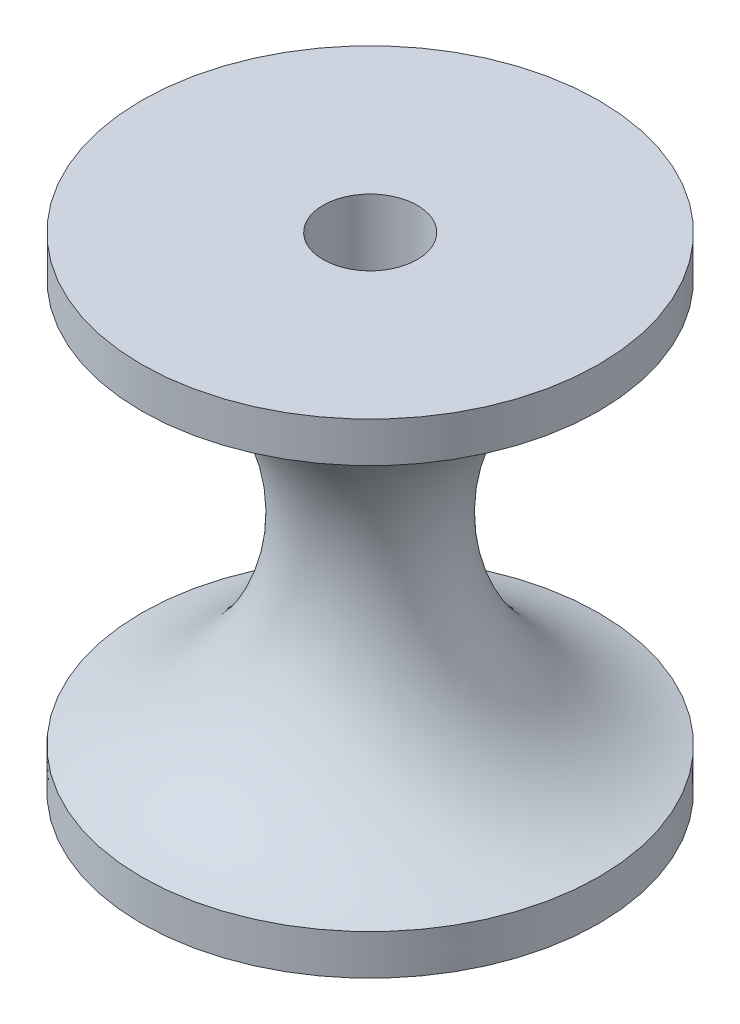
ISO-10303-21;
HEADER;
FILE_DESCRIPTION(('STEP AP214'),'2;1');
FILE_NAME('part.step','',(''),(''),'','','');
FILE_SCHEMA(('AUTOMOTIVE_DESIGN { 1 0 10303 214 1 1 1 1 }'));
ENDSEC;
DATA;
#1=APPLICATION_CONTEXT('core data for automotive mechanical design processes');
#2=APPLICATION_PROTOCOL_DEFINITION('international standard','automotive_design',2000,#1);
#3=PRODUCT_CONTEXT('',#1,'mechanical');
#4=PRODUCT('Part','Part','',(#3));
#5=PRODUCT_RELATED_PRODUCT_CATEGORY('part','',(#4));
#6=PRODUCT_DEFINITION_FORMATION('','',#4);
#7=PRODUCT_DEFINITION_CONTEXT('part definition',#1,'design');
#8=PRODUCT_DEFINITION('design','',#6,#7);
#9=PRODUCT_DEFINITION_SHAPE('','',#8);
#10=(LENGTH_UNIT() NAMED_UNIT(*) SI_UNIT(.MILLI.,.METRE.));
#11=(NAMED_UNIT(*) PLANE_ANGLE_UNIT() SI_UNIT($,.RADIAN.));
#12=(NAMED_UNIT(*) SI_UNIT($,.STERADIAN.) SOLID_ANGLE_UNIT());
#13=UNCERTAINTY_MEASURE_WITH_UNIT(LENGTH_MEASURE(1.E-05),#10,'distance_accuracy_value','');
#14=(GEOMETRIC_REPRESENTATION_CONTEXT(3) GLOBAL_UNCERTAINTY_ASSIGNED_CONTEXT((#13)) GLOBAL_UNIT_ASSIGNED_CONTEXT((#10,
#11,#12)) REPRESENTATION_CONTEXT('',''));
#15=CARTESIAN_POINT('',(0.,0.,0.));
#16=DIRECTION('',(0.,0.,1.));
#17=DIRECTION('',(1.,0.,0.));
#18=AXIS2_PLACEMENT_3D('',#15,#16,#17);
#19=CARTESIAN_POINT('',(0.,0.,0.));
#20=DIRECTION('',(0.,1.,0.));
#21=DIRECTION('',(0.,0.,1.));
#22=AXIS2_PLACEMENT_3D('',#19,#20,#21);
#23=PLANE('',#22);
#24=CARTESIAN_POINT('',(0.,0.,0.));
#25=DIRECTION('',(0.,1.,0.));
#26=DIRECTION('',(0.,0.,1.));
#27=AXIS2_PLACEMENT_3D('',#24,#25,#26);
#28=CIRCLE('',#27,3.5);
#29=CARTESIAN_POINT('',(0.,0.,3.5));
#30=VERTEX_POINT('',#29);
#31=EDGE_CURVE('E51',#30,#30,#28,.F.);
#32=ORIENTED_EDGE('',*,*,#31,.F.);
#33=EDGE_LOOP('',(#32));
#34=FACE_BOUND('',#33,.T.);
#35=CARTESIAN_POINT('',(0.,0.,0.));
#36=DIRECTION('',(0.,-1.,0.));
#37=DIRECTION('',(0.,0.,-1.));
#38=AXIS2_PLACEMENT_3D('',#35,#36,#37);
#39=CIRCLE('',#38,17.);
#40=CARTESIAN_POINT('',(0.,0.,-17.));
#41=VERTEX_POINT('',#40);
#42=EDGE_CURVE('E10',#41,#41,#39,.T.);
#43=ORIENTED_EDGE('',*,*,#42,.T.);
#44=EDGE_LOOP('',(#43));
#45=FACE_BOUND('',#44,.T.);
#46=ADVANCED_FACE('F32',(#34,#45),#23,.F.);
#47=CARTESIAN_POINT('',(0.,2.99997682550569,0.));
#48=DIRECTION('',(0.,1.,0.));
#49=DIRECTION('',(0.,0.,1.));
#50=AXIS2_PLACEMENT_3D('',#47,#48,#49);
#51=CONICAL_SURFACE('',#50,17.0000869053649,2.89686787266288E-05);
#52=ORIENTED_EDGE('',*,*,#42,.F.);
#53=EDGE_LOOP('',(#52));
#54=FACE_BOUND('',#53,.T.);
#55=CARTESIAN_POINT('',(0.,2.99997682550569,0.));
#56=DIRECTION('',(0.,-1.,0.));
#57=DIRECTION('',(0.,0.,-1.));
#58=AXIS2_PLACEMENT_3D('',#55,#56,#57);
#59=CIRCLE('',#58,17.0000869053649);
#60=CARTESIAN_POINT('',(0.,2.99997682550569,-17.0000869053649));
#61=VERTEX_POINT('',#60);
#62=EDGE_CURVE('E38',#61,#61,#59,.T.);
#63=ORIENTED_EDGE('',*,*,#62,.T.);
#64=EDGE_LOOP('',(#63));
#65=FACE_BOUND('',#64,.T.);
#66=ADVANCED_FACE('F75',(#54,#65),#51,.T.);
#67=CARTESIAN_POINT('',(0.,18.,0.));
#68=DIRECTION('',(0.,-1.,0.));
#69=DIRECTION('',(0.,0.,-1.));
#70=AXIS2_PLACEMENT_3D('',#67,#68,#69);
#71=TOROIDAL_SURFACE('',#70,21.,15.52417469626);
#72=ORIENTED_EDGE('',*,*,#62,.F.);
#73=EDGE_LOOP('',(#72));
#74=FACE_BOUND('',#73,.T.);
#75=CARTESIAN_POINT('',(0.,33.,0.));
#76=DIRECTION('',(0.,-1.,0.));
#77=DIRECTION('',(0.,0.,-1.));
#78=AXIS2_PLACEMENT_3D('',#75,#76,#77);
#79=CIRCLE('',#78,17.);
#80=CARTESIAN_POINT('',(0.,33.,-17.));
#81=VERTEX_POINT('',#80);
#82=EDGE_CURVE('E42',#81,#81,#79,.T.);
#83=ORIENTED_EDGE('',*,*,#82,.T.);
#84=EDGE_LOOP('',(#83));
#85=FACE_BOUND('',#84,.T.);
#86=ADVANCED_FACE('F69',(#74,#85),#71,.F.);
#87=CARTESIAN_POINT('',(0.,0.,0.));
#88=DIRECTION('',(0.,-1.,0.));
#89=DIRECTION('',(0.,0.,-1.));
#90=AXIS2_PLACEMENT_3D('',#87,#88,#89);
#91=CYLINDRICAL_SURFACE('',#90,17.);
#92=ORIENTED_EDGE('',*,*,#82,.F.);
#93=EDGE_LOOP('',(#92));
#94=FACE_BOUND('',#93,.T.);
#95=CARTESIAN_POINT('',(0.,36.,0.));
#96=DIRECTION('',(0.,-1.,0.));
#97=DIRECTION('',(0.,0.,-1.));
#98=AXIS2_PLACEMENT_3D('',#95,#96,#97);
#99=CIRCLE('',#98,17.);
#100=CARTESIAN_POINT('',(0.,36.,-17.));
#101=VERTEX_POINT('',#100);
#102=EDGE_CURVE('E46',#101,#101,#99,.T.);
#103=ORIENTED_EDGE('',*,*,#102,.T.);
#104=EDGE_LOOP('',(#103));
#105=FACE_BOUND('',#104,.T.);
#106=ADVANCED_FACE('F64',(#94,#105),#91,.T.);
#107=CARTESIAN_POINT('',(0.,36.,0.));
#108=DIRECTION('',(0.,-1.,0.));
#109=DIRECTION('',(0.,0.,-1.));
#110=AXIS2_PLACEMENT_3D('',#107,#108,#109);
#111=PLANE('',#110);
#112=CARTESIAN_POINT('',(0.,36.,0.));
#113=DIRECTION('',(0.,1.,0.));
#114=DIRECTION('',(0.,0.,1.));
#115=AXIS2_PLACEMENT_3D('',#112,#113,#114);
#116=CIRCLE('',#115,3.5);
#117=CARTESIAN_POINT('',(0.,36.,3.5));
#118=VERTEX_POINT('',#117);
#119=EDGE_CURVE('E54',#118,#118,#116,.T.);
#120=ORIENTED_EDGE('',*,*,#119,.F.);
#121=EDGE_LOOP('',(#120));
#122=FACE_BOUND('',#121,.T.);
#123=ORIENTED_EDGE('',*,*,#102,.F.);
#124=EDGE_LOOP('',(#123));
#125=FACE_BOUND('',#124,.T.);
#126=ADVANCED_FACE('F61',(#122,#125),#111,.F.);
#127=CARTESIAN_POINT('',(0.,-0.001000000000001,0.));
#128=DIRECTION('',(0.,1.,0.));
#129=DIRECTION('',(0.,0.,1.));
#130=AXIS2_PLACEMENT_3D('',#127,#128,#129);
#131=CYLINDRICAL_SURFACE('',#130,3.5);
#132=ORIENTED_EDGE('',*,*,#119,.T.);
#133=EDGE_LOOP('',(#132));
#134=FACE_BOUND('',#133,.T.);
#135=ORIENTED_EDGE('',*,*,#31,.T.);
#136=EDGE_LOOP('',(#135));
#137=FACE_BOUND('',#136,.T.);
#138=ADVANCED_FACE('F58',(#134,#137),#131,.F.);
#139=CLOSED_SHELL('',(#46,#66,#86,#106,#126,#138));
#140=MANIFOLD_SOLID_BREP('B2',#139);
#141=ADVANCED_BREP_SHAPE_REPRESENTATION('',(#18,#140),#14);
#142=SHAPE_DEFINITION_REPRESENTATION(#9,#141);
ENDSEC;
END-ISO-10303-21;
